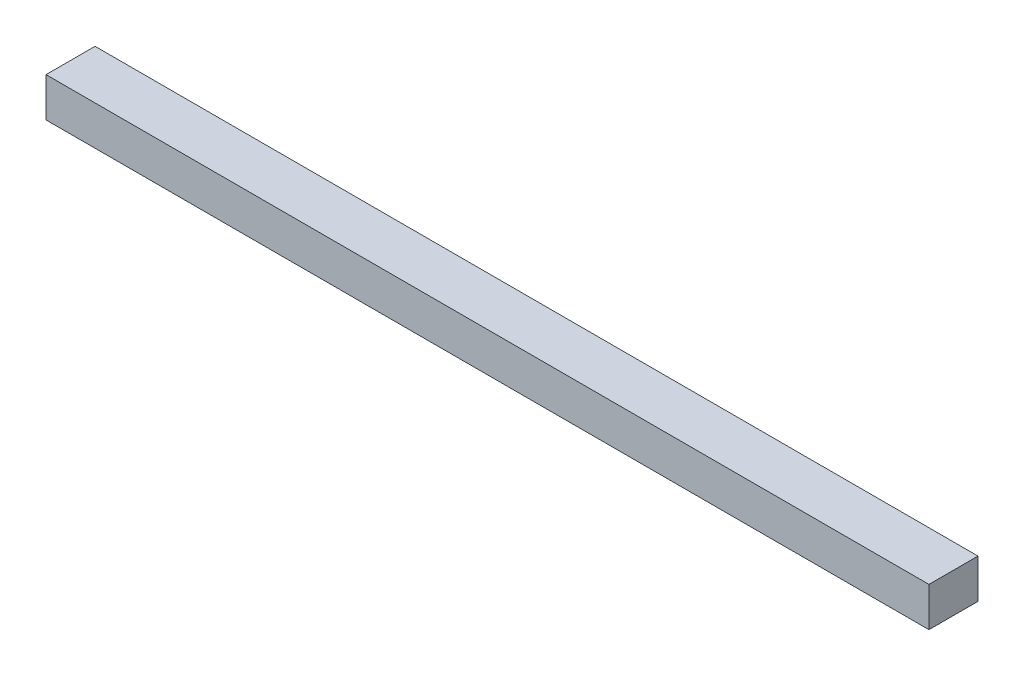
ISO-10303-21;
HEADER;
FILE_DESCRIPTION(('STEP AP214'),'2;1');
FILE_NAME('part.step','',(''),(''),'','','');
FILE_SCHEMA(('AUTOMOTIVE_DESIGN { 1 0 10303 214 1 1 1 1 }'));
ENDSEC;
DATA;
#1=APPLICATION_CONTEXT('core data for automotive mechanical design processes');
#2=APPLICATION_PROTOCOL_DEFINITION('international standard','automotive_design',2000,#1);
#3=PRODUCT_CONTEXT('',#1,'mechanical');
#4=PRODUCT('Part','Part','',(#3));
#5=PRODUCT_RELATED_PRODUCT_CATEGORY('part','',(#4));
#6=PRODUCT_DEFINITION_FORMATION('','',#4);
#7=PRODUCT_DEFINITION_CONTEXT('part definition',#1,'design');
#8=PRODUCT_DEFINITION('design','',#6,#7);
#9=PRODUCT_DEFINITION_SHAPE('','',#8);
#10=(LENGTH_UNIT() NAMED_UNIT(*) SI_UNIT(.MILLI.,.METRE.));
#11=(NAMED_UNIT(*) PLANE_ANGLE_UNIT() SI_UNIT($,.RADIAN.));
#12=(NAMED_UNIT(*) SI_UNIT($,.STERADIAN.) SOLID_ANGLE_UNIT());
#13=UNCERTAINTY_MEASURE_WITH_UNIT(LENGTH_MEASURE(1.E-05),#10,'distance_accuracy_value','');
#14=(GEOMETRIC_REPRESENTATION_CONTEXT(3) GLOBAL_UNCERTAINTY_ASSIGNED_CONTEXT((#13)) GLOBAL_UNIT_ASSIGNED_CONTEXT((#10,
#11,#12)) REPRESENTATION_CONTEXT('',''));
#15=CARTESIAN_POINT('',(0.,0.,0.));
#16=DIRECTION('',(0.,0.,1.));
#17=DIRECTION('',(1.,0.,0.));
#18=AXIS2_PLACEMENT_3D('',#15,#16,#17);
#19=CARTESIAN_POINT('',(-51.0641712641554,8.,-30.9727846263495));
#20=DIRECTION('',(1.,0.,0.));
#21=DIRECTION('',(0.,0.,-1.));
#22=AXIS2_PLACEMENT_3D('',#19,#20,#21);
#23=PLANE('',#22);
#24=DIRECTION('',(0.,0.,1.));
#25=VECTOR('',#24,1.);
#26=CARTESIAN_POINT('',(-51.0641712641554,0.,-30.9727846263495));
#27=LINE('',#26,#25);
#28=CARTESIAN_POINT('',(-51.0641712641554,0.,-30.9727846263495));
#29=VERTEX_POINT('',#28);
#30=CARTESIAN_POINT('',(-51.0641712641554,0.,-20.9727846263495));
#31=VERTEX_POINT('',#30);
#32=EDGE_CURVE('E98',#29,#31,#27,.T.);
#33=ORIENTED_EDGE('',*,*,#32,.T.);
#34=DIRECTION('',(0.,-1.,0.));
#35=VECTOR('',#34,1.);
#36=CARTESIAN_POINT('',(-51.0641712641554,8.,-20.9727846263495));
#37=LINE('',#36,#35);
#38=CARTESIAN_POINT('',(-51.0641712641554,8.,-20.9727846263495));
#39=VERTEX_POINT('',#38);
#40=EDGE_CURVE('E11',#39,#31,#37,.T.);
#41=ORIENTED_EDGE('',*,*,#40,.F.);
#42=DIRECTION('',(0.,0.,1.));
#43=VECTOR('',#42,1.);
#44=CARTESIAN_POINT('',(-51.0641712641554,8.,-30.9727846263495));
#45=LINE('',#44,#43);
#46=CARTESIAN_POINT('',(-51.0641712641554,8.,-30.9727846263495));
#47=VERTEX_POINT('',#46);
#48=EDGE_CURVE('E86',#47,#39,#45,.T.);
#49=ORIENTED_EDGE('',*,*,#48,.F.);
#50=DIRECTION('',(0.,-1.,0.));
#51=VECTOR('',#50,1.);
#52=CARTESIAN_POINT('',(-51.0641712641554,8.,-30.9727846263495));
#53=LINE('',#52,#51);
#54=EDGE_CURVE('E94',#47,#29,#53,.T.);
#55=ORIENTED_EDGE('',*,*,#54,.T.);
#56=EDGE_LOOP('',(#33,#41,#49,#55));
#57=FACE_BOUND('',#56,.T.);
#58=ADVANCED_FACE('F35',(#57),#23,.F.);
#59=CARTESIAN_POINT('',(-51.0641712641554,8.,-20.9727846263495));
#60=DIRECTION('',(0.,0.,-1.));
#61=DIRECTION('',(-1.,0.,0.));
#62=AXIS2_PLACEMENT_3D('',#59,#60,#61);
#63=PLANE('',#62);
#64=DIRECTION('',(1.,0.,0.));
#65=VECTOR('',#64,1.);
#66=CARTESIAN_POINT('',(-51.0641712641554,0.,-20.9727846263495));
#67=LINE('',#66,#65);
#68=CARTESIAN_POINT('',(128.935828735845,0.,-20.9727846263495));
#69=VERTEX_POINT('',#68);
#70=EDGE_CURVE('E90',#31,#69,#67,.T.);
#71=ORIENTED_EDGE('',*,*,#70,.T.);
#72=DIRECTION('',(0.,-1.,0.));
#73=VECTOR('',#72,1.);
#74=CARTESIAN_POINT('',(128.935828735845,8.,-20.9727846263495));
#75=LINE('',#74,#73);
#76=CARTESIAN_POINT('',(128.935828735845,8.,-20.9727846263495));
#77=VERTEX_POINT('',#76);
#78=EDGE_CURVE('E43',#77,#69,#75,.T.);
#79=ORIENTED_EDGE('',*,*,#78,.F.);
#80=DIRECTION('',(1.,0.,0.));
#81=VECTOR('',#80,1.);
#82=CARTESIAN_POINT('',(-51.0641712641554,8.,-20.9727846263495));
#83=LINE('',#82,#81);
#84=EDGE_CURVE('E81',#39,#77,#83,.T.);
#85=ORIENTED_EDGE('',*,*,#84,.F.);
#86=ORIENTED_EDGE('',*,*,#40,.T.);
#87=EDGE_LOOP('',(#71,#79,#85,#86));
#88=FACE_BOUND('',#87,.T.);
#89=ADVANCED_FACE('F89',(#88),#63,.F.);
#90=CARTESIAN_POINT('',(128.935828735845,8.,-30.9727846263495));
#91=DIRECTION('',(-1.,0.,0.));
#92=DIRECTION('',(0.,0.,1.));
#93=AXIS2_PLACEMENT_3D('',#90,#91,#92);
#94=PLANE('',#93);
#95=DIRECTION('',(0.,0.,-1.));
#96=VECTOR('',#95,1.);
#97=CARTESIAN_POINT('',(128.935828735845,0.,-30.9727846263495));
#98=LINE('',#97,#96);
#99=CARTESIAN_POINT('',(128.935828735845,0.,-30.9727846263495));
#100=VERTEX_POINT('',#99);
#101=EDGE_CURVE('E68',#69,#100,#98,.T.);
#102=ORIENTED_EDGE('',*,*,#101,.T.);
#103=DIRECTION('',(0.,-1.,0.));
#104=VECTOR('',#103,1.);
#105=CARTESIAN_POINT('',(128.935828735845,8.,-30.9727846263495));
#106=LINE('',#105,#104);
#107=CARTESIAN_POINT('',(128.935828735845,8.,-30.9727846263495));
#108=VERTEX_POINT('',#107);
#109=EDGE_CURVE('E91',#108,#100,#106,.T.);
#110=ORIENTED_EDGE('',*,*,#109,.F.);
#111=DIRECTION('',(0.,0.,-1.));
#112=VECTOR('',#111,1.);
#113=CARTESIAN_POINT('',(128.935828735845,8.,-30.9727846263495));
#114=LINE('',#113,#112);
#115=EDGE_CURVE('E84',#77,#108,#114,.T.);
#116=ORIENTED_EDGE('',*,*,#115,.F.);
#117=ORIENTED_EDGE('',*,*,#78,.T.);
#118=EDGE_LOOP('',(#102,#110,#116,#117));
#119=FACE_BOUND('',#118,.T.);
#120=ADVANCED_FACE('F92',(#119),#94,.F.);
#121=CARTESIAN_POINT('',(-51.0641712641554,8.,-30.9727846263495));
#122=DIRECTION('',(0.,0.,1.));
#123=DIRECTION('',(1.,0.,0.));
#124=AXIS2_PLACEMENT_3D('',#121,#122,#123);
#125=PLANE('',#124);
#126=DIRECTION('',(-1.,0.,0.));
#127=VECTOR('',#126,1.);
#128=CARTESIAN_POINT('',(-51.0641712641554,0.,-30.9727846263495));
#129=LINE('',#128,#127);
#130=EDGE_CURVE('E74',#100,#29,#129,.T.);
#131=ORIENTED_EDGE('',*,*,#130,.T.);
#132=ORIENTED_EDGE('',*,*,#54,.F.);
#133=DIRECTION('',(-1.,0.,0.));
#134=VECTOR('',#133,1.);
#135=CARTESIAN_POINT('',(-51.0641712641554,8.,-30.9727846263495));
#136=LINE('',#135,#134);
#137=EDGE_CURVE('E51',#108,#47,#136,.T.);
#138=ORIENTED_EDGE('',*,*,#137,.F.);
#139=ORIENTED_EDGE('',*,*,#109,.T.);
#140=EDGE_LOOP('',(#131,#132,#138,#139));
#141=FACE_BOUND('',#140,.T.);
#142=ADVANCED_FACE('F105',(#141),#125,.F.);
#143=CARTESIAN_POINT('',(0.,8.,0.));
#144=DIRECTION('',(0.,1.,0.));
#145=DIRECTION('',(0.,0.,1.));
#146=AXIS2_PLACEMENT_3D('',#143,#144,#145);
#147=PLANE('',#146);
#148=ORIENTED_EDGE('',*,*,#48,.T.);
#149=ORIENTED_EDGE('',*,*,#84,.T.);
#150=ORIENTED_EDGE('',*,*,#115,.T.);
#151=ORIENTED_EDGE('',*,*,#137,.T.);
#152=EDGE_LOOP('',(#148,#149,#150,#151));
#153=FACE_BOUND('',#152,.T.);
#154=ADVANCED_FACE('F82',(#153),#147,.T.);
#155=CARTESIAN_POINT('',(0.,0.,0.));
#156=DIRECTION('',(0.,1.,0.));
#157=DIRECTION('',(0.,0.,1.));
#158=AXIS2_PLACEMENT_3D('',#155,#156,#157);
#159=PLANE('',#158);
#160=ORIENTED_EDGE('',*,*,#32,.F.);
#161=ORIENTED_EDGE('',*,*,#130,.F.);
#162=ORIENTED_EDGE('',*,*,#101,.F.);
#163=ORIENTED_EDGE('',*,*,#70,.F.);
#164=EDGE_LOOP('',(#160,#161,#162,#163));
#165=FACE_BOUND('',#164,.T.);
#166=ADVANCED_FACE('F108',(#165),#159,.F.);
#167=CLOSED_SHELL('',(#58,#89,#120,#142,#154,#166));
#168=MANIFOLD_SOLID_BREP('B2',#167);
#169=ADVANCED_BREP_SHAPE_REPRESENTATION('',(#18,#168),#14);
#170=SHAPE_DEFINITION_REPRESENTATION(#9,#169);
ENDSEC;
END-ISO-10303-21;
